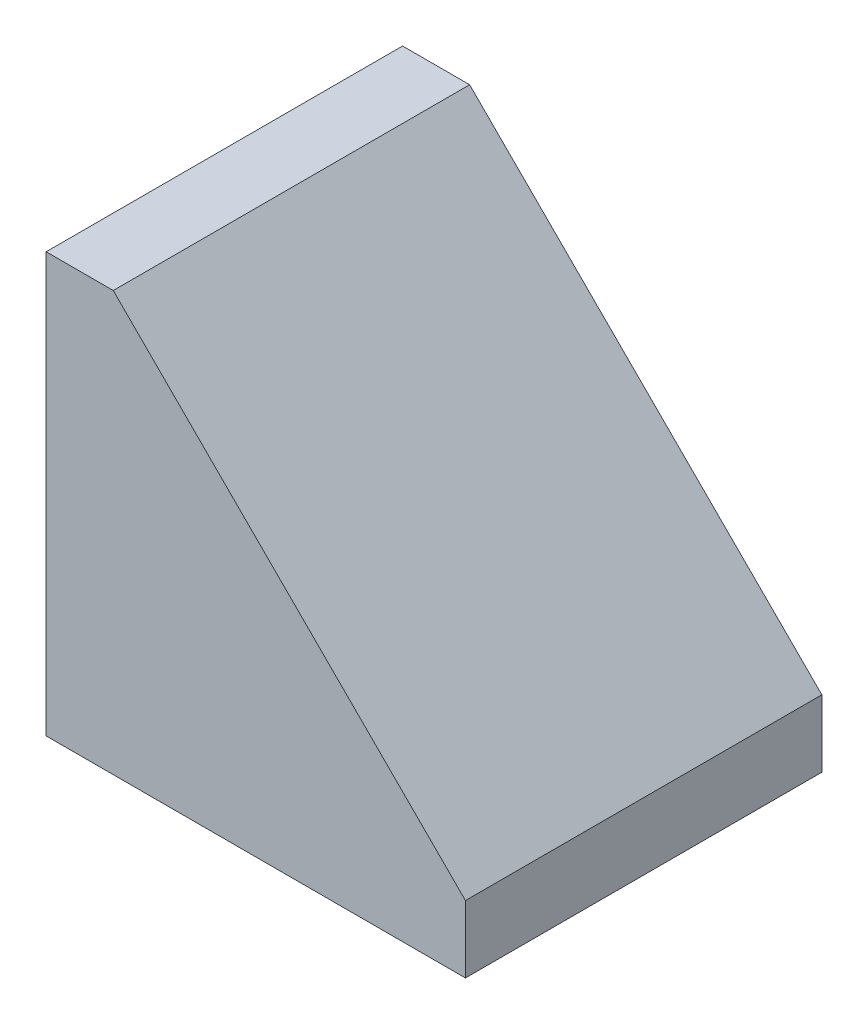
ISO-10303-21;
HEADER;
FILE_DESCRIPTION(('STEP AP214'),'2;1');
FILE_NAME('part.step','',(''),(''),'','','');
FILE_SCHEMA(('AUTOMOTIVE_DESIGN { 1 0 10303 214 1 1 1 1 }'));
ENDSEC;
DATA;
#1=APPLICATION_CONTEXT('core data for automotive mechanical design processes');
#2=APPLICATION_PROTOCOL_DEFINITION('international standard','automotive_design',2000,#1);
#3=PRODUCT_CONTEXT('',#1,'mechanical');
#4=PRODUCT('Part','Part','',(#3));
#5=PRODUCT_RELATED_PRODUCT_CATEGORY('part','',(#4));
#6=PRODUCT_DEFINITION_FORMATION('','',#4);
#7=PRODUCT_DEFINITION_CONTEXT('part definition',#1,'design');
#8=PRODUCT_DEFINITION('design','',#6,#7);
#9=PRODUCT_DEFINITION_SHAPE('','',#8);
#10=(LENGTH_UNIT() NAMED_UNIT(*) SI_UNIT(.MILLI.,.METRE.));
#11=(NAMED_UNIT(*) PLANE_ANGLE_UNIT() SI_UNIT($,.RADIAN.));
#12=(NAMED_UNIT(*) SI_UNIT($,.STERADIAN.) SOLID_ANGLE_UNIT());
#13=UNCERTAINTY_MEASURE_WITH_UNIT(LENGTH_MEASURE(1.E-05),#10,'distance_accuracy_value','');
#14=(GEOMETRIC_REPRESENTATION_CONTEXT(3) GLOBAL_UNCERTAINTY_ASSIGNED_CONTEXT((#13)) GLOBAL_UNIT_ASSIGNED_CONTEXT((#10,
#11,#12)) REPRESENTATION_CONTEXT('',''));
#15=CARTESIAN_POINT('',(0.,0.,0.));
#16=DIRECTION('',(0.,0.,1.));
#17=DIRECTION('',(1.,0.,0.));
#18=AXIS2_PLACEMENT_3D('',#15,#16,#17);
#19=CARTESIAN_POINT('',(3.2,20.,17.));
#20=DIRECTION('',(0.,-1.,0.));
#21=DIRECTION('',(0.,0.,-1.));
#22=AXIS2_PLACEMENT_3D('',#19,#20,#21);
#23=PLANE('',#22);
#24=DIRECTION('',(-1.,0.,0.));
#25=VECTOR('',#24,1.);
#26=CARTESIAN_POINT('',(3.2,20.,0.));
#27=LINE('',#26,#25);
#28=CARTESIAN_POINT('',(3.2,20.,0.));
#29=VERTEX_POINT('',#28);
#30=CARTESIAN_POINT('',(0.,20.,0.));
#31=VERTEX_POINT('',#30);
#32=EDGE_CURVE('E111',#29,#31,#27,.T.);
#33=ORIENTED_EDGE('',*,*,#32,.T.);
#34=DIRECTION('',(0.,0.,-1.));
#35=VECTOR('',#34,1.);
#36=CARTESIAN_POINT('',(0.,20.,17.));
#37=LINE('',#36,#35);
#38=CARTESIAN_POINT('',(0.,20.,17.));
#39=VERTEX_POINT('',#38);
#40=EDGE_CURVE('E11',#39,#31,#37,.T.);
#41=ORIENTED_EDGE('',*,*,#40,.F.);
#42=DIRECTION('',(-1.,0.,0.));
#43=VECTOR('',#42,1.);
#44=CARTESIAN_POINT('',(3.2,20.,17.));
#45=LINE('',#44,#43);
#46=CARTESIAN_POINT('',(3.2,20.,17.));
#47=VERTEX_POINT('',#46);
#48=EDGE_CURVE('E119',#47,#39,#45,.T.);
#49=ORIENTED_EDGE('',*,*,#48,.F.);
#50=DIRECTION('',(0.,0.,-1.));
#51=VECTOR('',#50,1.);
#52=CARTESIAN_POINT('',(3.2,20.,17.));
#53=LINE('',#52,#51);
#54=EDGE_CURVE('E107',#47,#29,#53,.T.);
#55=ORIENTED_EDGE('',*,*,#54,.T.);
#56=EDGE_LOOP('',(#33,#41,#49,#55));
#57=FACE_BOUND('',#56,.T.);
#58=ADVANCED_FACE('F37',(#57),#23,.F.);
#59=CARTESIAN_POINT('',(0.,20.,17.));
#60=DIRECTION('',(1.,0.,0.));
#61=DIRECTION('',(0.,0.,-1.));
#62=AXIS2_PLACEMENT_3D('',#59,#60,#61);
#63=PLANE('',#62);
#64=DIRECTION('',(0.,-1.,0.));
#65=VECTOR('',#64,1.);
#66=CARTESIAN_POINT('',(0.,20.,0.));
#67=LINE('',#66,#65);
#68=CARTESIAN_POINT('',(0.,0.,0.));
#69=VERTEX_POINT('',#68);
#70=EDGE_CURVE('E114',#31,#69,#67,.T.);
#71=ORIENTED_EDGE('',*,*,#70,.T.);
#72=DIRECTION('',(0.,0.,-1.));
#73=VECTOR('',#72,1.);
#74=CARTESIAN_POINT('',(0.,0.,17.));
#75=LINE('',#74,#73);
#76=CARTESIAN_POINT('',(0.,0.,17.));
#77=VERTEX_POINT('',#76);
#78=EDGE_CURVE('E45',#77,#69,#75,.T.);
#79=ORIENTED_EDGE('',*,*,#78,.F.);
#80=DIRECTION('',(0.,-1.,0.));
#81=VECTOR('',#80,1.);
#82=CARTESIAN_POINT('',(0.,20.,17.));
#83=LINE('',#82,#81);
#84=EDGE_CURVE('E87',#39,#77,#83,.T.);
#85=ORIENTED_EDGE('',*,*,#84,.F.);
#86=ORIENTED_EDGE('',*,*,#40,.T.);
#87=EDGE_LOOP('',(#71,#79,#85,#86));
#88=FACE_BOUND('',#87,.T.);
#89=ADVANCED_FACE('F138',(#88),#63,.F.);
#90=CARTESIAN_POINT('',(0.,0.,17.));
#91=DIRECTION('',(0.,1.,0.));
#92=DIRECTION('',(0.,0.,1.));
#93=AXIS2_PLACEMENT_3D('',#90,#91,#92);
#94=PLANE('',#93);
#95=DIRECTION('',(1.,0.,0.));
#96=VECTOR('',#95,1.);
#97=CARTESIAN_POINT('',(0.,0.,0.));
#98=LINE('',#97,#96);
#99=CARTESIAN_POINT('',(20.,0.,0.));
#100=VERTEX_POINT('',#99);
#101=EDGE_CURVE('E102',#69,#100,#98,.T.);
#102=ORIENTED_EDGE('',*,*,#101,.T.);
#103=DIRECTION('',(0.,0.,-1.));
#104=VECTOR('',#103,1.);
#105=CARTESIAN_POINT('',(20.,0.,17.));
#106=LINE('',#105,#104);
#107=CARTESIAN_POINT('',(20.,0.,17.));
#108=VERTEX_POINT('',#107);
#109=EDGE_CURVE('E99',#108,#100,#106,.T.);
#110=ORIENTED_EDGE('',*,*,#109,.F.);
#111=DIRECTION('',(1.,0.,0.));
#112=VECTOR('',#111,1.);
#113=CARTESIAN_POINT('',(0.,0.,17.));
#114=LINE('',#113,#112);
#115=EDGE_CURVE('E91',#77,#108,#114,.T.);
#116=ORIENTED_EDGE('',*,*,#115,.F.);
#117=ORIENTED_EDGE('',*,*,#78,.T.);
#118=EDGE_LOOP('',(#102,#110,#116,#117));
#119=FACE_BOUND('',#118,.T.);
#120=ADVANCED_FACE('F100',(#119),#94,.F.);
#121=CARTESIAN_POINT('',(20.,0.,17.));
#122=DIRECTION('',(-1.,0.,0.));
#123=DIRECTION('',(0.,0.,1.));
#124=AXIS2_PLACEMENT_3D('',#121,#122,#123);
#125=PLANE('',#124);
#126=DIRECTION('',(0.,1.,0.));
#127=VECTOR('',#126,1.);
#128=CARTESIAN_POINT('',(20.,0.,0.));
#129=LINE('',#128,#127);
#130=CARTESIAN_POINT('',(20.,3.2,0.));
#131=VERTEX_POINT('',#130);
#132=EDGE_CURVE('E73',#100,#131,#129,.T.);
#133=ORIENTED_EDGE('',*,*,#132,.T.);
#134=DIRECTION('',(0.,0.,-1.));
#135=VECTOR('',#134,1.);
#136=CARTESIAN_POINT('',(20.,3.2,17.));
#137=LINE('',#136,#135);
#138=CARTESIAN_POINT('',(20.,3.2,17.));
#139=VERTEX_POINT('',#138);
#140=EDGE_CURVE('E103',#139,#131,#137,.T.);
#141=ORIENTED_EDGE('',*,*,#140,.F.);
#142=DIRECTION('',(0.,1.,0.));
#143=VECTOR('',#142,1.);
#144=CARTESIAN_POINT('',(20.,0.,17.));
#145=LINE('',#144,#143);
#146=EDGE_CURVE('E95',#108,#139,#145,.T.);
#147=ORIENTED_EDGE('',*,*,#146,.F.);
#148=ORIENTED_EDGE('',*,*,#109,.T.);
#149=EDGE_LOOP('',(#133,#141,#147,#148));
#150=FACE_BOUND('',#149,.T.);
#151=ADVANCED_FACE('F105',(#150),#125,.F.);
#152=CARTESIAN_POINT('',(20.,3.2,17.));
#153=DIRECTION('',(-0.707106781186547,-0.707106781186547,0.));
#154=DIRECTION('',(0.707106781186548,-0.707106781186548,0.));
#155=AXIS2_PLACEMENT_3D('',#152,#153,#154);
#156=PLANE('',#155);
#157=DIRECTION('',(-0.707106781186548,0.707106781186548,0.));
#158=VECTOR('',#157,1.);
#159=CARTESIAN_POINT('',(20.,3.2,0.));
#160=LINE('',#159,#158);
#161=EDGE_CURVE('E79',#131,#29,#160,.T.);
#162=ORIENTED_EDGE('',*,*,#161,.T.);
#163=ORIENTED_EDGE('',*,*,#54,.F.);
#164=DIRECTION('',(-0.707106781186548,0.707106781186548,0.));
#165=VECTOR('',#164,1.);
#166=CARTESIAN_POINT('',(20.,3.2,17.));
#167=LINE('',#166,#165);
#168=EDGE_CURVE('E53',#139,#47,#167,.T.);
#169=ORIENTED_EDGE('',*,*,#168,.F.);
#170=ORIENTED_EDGE('',*,*,#140,.T.);
#171=EDGE_LOOP('',(#162,#163,#169,#170));
#172=FACE_BOUND('',#171,.T.);
#173=ADVANCED_FACE('F127',(#172),#156,.F.);
#174=CARTESIAN_POINT('',(0.,0.,17.));
#175=DIRECTION('',(0.,0.,1.));
#176=DIRECTION('',(1.,0.,0.));
#177=AXIS2_PLACEMENT_3D('',#174,#175,#176);
#178=PLANE('',#177);
#179=ORIENTED_EDGE('',*,*,#48,.T.);
#180=ORIENTED_EDGE('',*,*,#84,.T.);
#181=ORIENTED_EDGE('',*,*,#115,.T.);
#182=ORIENTED_EDGE('',*,*,#146,.T.);
#183=ORIENTED_EDGE('',*,*,#168,.T.);
#184=EDGE_LOOP('',(#179,#180,#181,#182,#183));
#185=FACE_BOUND('',#184,.T.);
#186=ADVANCED_FACE('F93',(#185),#178,.T.);
#187=CARTESIAN_POINT('',(0.,0.,0.));
#188=DIRECTION('',(0.,0.,1.));
#189=DIRECTION('',(1.,0.,0.));
#190=AXIS2_PLACEMENT_3D('',#187,#188,#189);
#191=PLANE('',#190);
#192=ORIENTED_EDGE('',*,*,#32,.F.);
#193=ORIENTED_EDGE('',*,*,#161,.F.);
#194=ORIENTED_EDGE('',*,*,#132,.F.);
#195=ORIENTED_EDGE('',*,*,#101,.F.);
#196=ORIENTED_EDGE('',*,*,#70,.F.);
#197=EDGE_LOOP('',(#192,#193,#194,#195,#196));
#198=FACE_BOUND('',#197,.T.);
#199=ADVANCED_FACE('F123',(#198),#191,.F.);
#200=CLOSED_SHELL('',(#58,#89,#120,#151,#173,#186,#199));
#201=MANIFOLD_SOLID_BREP('B2',#200);
#202=ADVANCED_BREP_SHAPE_REPRESENTATION('',(#18,#201),#14);
#203=SHAPE_DEFINITION_REPRESENTATION(#9,#202);
ENDSEC;
END-ISO-10303-21;
